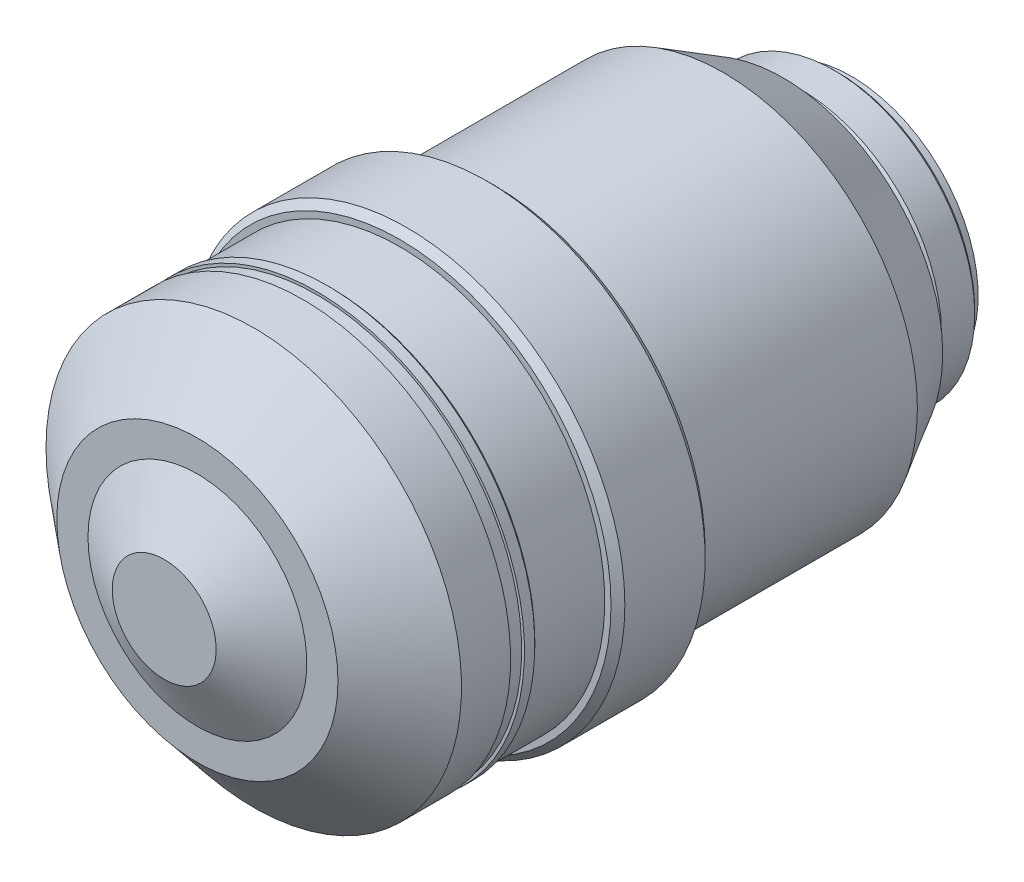
ISO-10303-21;
HEADER;
FILE_DESCRIPTION(('STEP AP214'),'2;1');
FILE_NAME('part.step','',(''),(''),'','','');
FILE_SCHEMA(('AUTOMOTIVE_DESIGN { 1 0 10303 214 1 1 1 1 }'));
ENDSEC;
DATA;
#1=APPLICATION_CONTEXT('core data for automotive mechanical design processes');
#2=APPLICATION_PROTOCOL_DEFINITION('international standard','automotive_design',2000,#1);
#3=PRODUCT_CONTEXT('',#1,'mechanical');
#4=PRODUCT('Part','Part','',(#3));
#5=PRODUCT_RELATED_PRODUCT_CATEGORY('part','',(#4));
#6=PRODUCT_DEFINITION_FORMATION('','',#4);
#7=PRODUCT_DEFINITION_CONTEXT('part definition',#1,'design');
#8=PRODUCT_DEFINITION('design','',#6,#7);
#9=PRODUCT_DEFINITION_SHAPE('','',#8);
#10=(LENGTH_UNIT() NAMED_UNIT(*) SI_UNIT(.MILLI.,.METRE.));
#11=(NAMED_UNIT(*) PLANE_ANGLE_UNIT() SI_UNIT($,.RADIAN.));
#12=(NAMED_UNIT(*) SI_UNIT($,.STERADIAN.) SOLID_ANGLE_UNIT());
#13=UNCERTAINTY_MEASURE_WITH_UNIT(LENGTH_MEASURE(1.E-05),#10,'distance_accuracy_value','');
#14=(GEOMETRIC_REPRESENTATION_CONTEXT(3) GLOBAL_UNCERTAINTY_ASSIGNED_CONTEXT((#13)) GLOBAL_UNIT_ASSIGNED_CONTEXT((#10,
#11,#12)) REPRESENTATION_CONTEXT('',''));
#15=CARTESIAN_POINT('',(0.,0.,0.));
#16=DIRECTION('',(0.,0.,1.));
#17=DIRECTION('',(1.,0.,0.));
#18=AXIS2_PLACEMENT_3D('',#15,#16,#17);
#19=CARTESIAN_POINT('',(0.,0.,-0.35));
#20=DIRECTION('',(0.,0.,1.));
#21=DIRECTION('',(1.,0.,0.));
#22=AXIS2_PLACEMENT_3D('',#19,#20,#21);
#23=PLANE('',#22);
#24=CARTESIAN_POINT('',(0.,0.,-0.349999999999996));
#25=DIRECTION('',(0.,0.,-1.));
#26=DIRECTION('',(-1.,0.,0.));
#27=AXIS2_PLACEMENT_3D('',#24,#25,#26);
#28=CIRCLE('',#27,3.75);
#29=CARTESIAN_POINT('',(-3.75,0.,-0.349999999999996));
#30=VERTEX_POINT('',#29);
#31=EDGE_CURVE('E68',#30,#30,#28,.T.);
#32=ORIENTED_EDGE('',*,*,#31,.F.);
#33=EDGE_LOOP('',(#32));
#34=FACE_BOUND('',#33,.T.);
#35=ADVANCED_FACE('F30',(#34),#23,.T.);
#36=CARTESIAN_POINT('',(0.,0.,-2.74600361713695));
#37=DIRECTION('',(0.,0.,-1.));
#38=DIRECTION('',(-1.,0.,0.));
#39=AXIS2_PLACEMENT_3D('',#36,#37,#38);
#40=CONICAL_SURFACE('',#39,7.9,1.0471975511966);
#41=ORIENTED_EDGE('',*,*,#31,.T.);
#42=EDGE_LOOP('',(#41));
#43=FACE_BOUND('',#42,.T.);
#44=CARTESIAN_POINT('',(0.,0.,-2.74600361713695));
#45=DIRECTION('',(0.,0.,-1.));
#46=DIRECTION('',(-1.,0.,0.));
#47=AXIS2_PLACEMENT_3D('',#44,#45,#46);
#48=CIRCLE('',#47,7.9);
#49=CARTESIAN_POINT('',(-7.9,0.,-2.74600361713695));
#50=VERTEX_POINT('',#49);
#51=EDGE_CURVE('E71',#50,#50,#48,.T.);
#52=ORIENTED_EDGE('',*,*,#51,.F.);
#53=EDGE_LOOP('',(#52));
#54=FACE_BOUND('',#53,.T.);
#55=ADVANCED_FACE('F150',(#43,#54),#40,.T.);
#56=CARTESIAN_POINT('',(-7.9,0.,-2.74600361713695));
#57=DIRECTION('',(0.,0.,1.));
#58=DIRECTION('',(1.,0.,0.));
#59=AXIS2_PLACEMENT_3D('',#56,#57,#58);
#60=PLANE('',#59);
#61=ORIENTED_EDGE('',*,*,#51,.T.);
#62=EDGE_LOOP('',(#61));
#63=FACE_BOUND('',#62,.T.);
#64=CARTESIAN_POINT('',(0.,0.,-2.74600361713695));
#65=DIRECTION('',(0.,0.,-1.));
#66=DIRECTION('',(-1.,0.,0.));
#67=AXIS2_PLACEMENT_3D('',#64,#65,#66);
#68=CIRCLE('',#67,10.15);
#69=CARTESIAN_POINT('',(-10.15,0.,-2.74600361713695));
#70=VERTEX_POINT('',#69);
#71=EDGE_CURVE('E74',#70,#70,#68,.T.);
#72=ORIENTED_EDGE('',*,*,#71,.F.);
#73=EDGE_LOOP('',(#72));
#74=FACE_BOUND('',#73,.T.);
#75=ADVANCED_FACE('F156',(#63,#74),#60,.T.);
#76=CARTESIAN_POINT('',(0.,0.,-6.81563682834677));
#77=DIRECTION('',(0.,0.,-1.));
#78=DIRECTION('',(-1.,0.,0.));
#79=AXIS2_PLACEMENT_3D('',#76,#77,#78);
#80=CONICAL_SURFACE('',#79,15.,0.872664625997164);
#81=ORIENTED_EDGE('',*,*,#71,.T.);
#82=EDGE_LOOP('',(#81));
#83=FACE_BOUND('',#82,.T.);
#84=CARTESIAN_POINT('',(0.,0.,-6.81563682834677));
#85=DIRECTION('',(0.,0.,-1.));
#86=DIRECTION('',(-1.,0.,0.));
#87=AXIS2_PLACEMENT_3D('',#84,#85,#86);
#88=CIRCLE('',#87,15.);
#89=CARTESIAN_POINT('',(-15.,0.,-6.81563682834677));
#90=VERTEX_POINT('',#89);
#91=EDGE_CURVE('E77',#90,#90,#88,.T.);
#92=ORIENTED_EDGE('',*,*,#91,.F.);
#93=EDGE_LOOP('',(#92));
#94=FACE_BOUND('',#93,.T.);
#95=ADVANCED_FACE('F251',(#83,#94),#80,.T.);
#96=CARTESIAN_POINT('',(0.,0.,-49.96));
#97=DIRECTION('',(0.,0.,-1.));
#98=DIRECTION('',(-1.,0.,0.));
#99=AXIS2_PLACEMENT_3D('',#96,#97,#98);
#100=CYLINDRICAL_SURFACE('',#99,15.);
#101=ORIENTED_EDGE('',*,*,#91,.T.);
#102=EDGE_LOOP('',(#101));
#103=FACE_BOUND('',#102,.T.);
#104=CARTESIAN_POINT('',(0.,0.,-10.36));
#105=DIRECTION('',(0.,0.,-1.));
#106=DIRECTION('',(-1.,0.,0.));
#107=AXIS2_PLACEMENT_3D('',#104,#105,#106);
#108=CIRCLE('',#107,15.);
#109=CARTESIAN_POINT('',(-15.,0.,-10.36));
#110=VERTEX_POINT('',#109);
#111=EDGE_CURVE('E80',#110,#110,#108,.T.);
#112=ORIENTED_EDGE('',*,*,#111,.F.);
#113=EDGE_LOOP('',(#112));
#114=FACE_BOUND('',#113,.T.);
#115=ADVANCED_FACE('F247',(#103,#114),#100,.T.);
#116=CARTESIAN_POINT('',(-14.8,0.,-10.36));
#117=DIRECTION('',(0.,0.,-1.));
#118=DIRECTION('',(-1.,0.,0.));
#119=AXIS2_PLACEMENT_3D('',#116,#117,#118);
#120=PLANE('',#119);
#121=ORIENTED_EDGE('',*,*,#111,.T.);
#122=EDGE_LOOP('',(#121));
#123=FACE_BOUND('',#122,.T.);
#124=CARTESIAN_POINT('',(0.,0.,-10.36));
#125=DIRECTION('',(0.,0.,-1.));
#126=DIRECTION('',(-1.,0.,0.));
#127=AXIS2_PLACEMENT_3D('',#124,#125,#126);
#128=CIRCLE('',#127,14.8);
#129=CARTESIAN_POINT('',(-14.8,0.,-10.36));
#130=VERTEX_POINT('',#129);
#131=EDGE_CURVE('E83',#130,#130,#128,.T.);
#132=ORIENTED_EDGE('',*,*,#131,.F.);
#133=EDGE_LOOP('',(#132));
#134=FACE_BOUND('',#133,.T.);
#135=ADVANCED_FACE('F243',(#123,#134),#120,.T.);
#136=CARTESIAN_POINT('',(0.,0.,-49.96));
#137=DIRECTION('',(0.,0.,-1.));
#138=DIRECTION('',(-1.,0.,0.));
#139=AXIS2_PLACEMENT_3D('',#136,#137,#138);
#140=CYLINDRICAL_SURFACE('',#139,14.8);
#141=ORIENTED_EDGE('',*,*,#131,.T.);
#142=EDGE_LOOP('',(#141));
#143=FACE_BOUND('',#142,.T.);
#144=CARTESIAN_POINT('',(0.,0.,-11.36));
#145=DIRECTION('',(0.,0.,-1.));
#146=DIRECTION('',(-1.,0.,0.));
#147=AXIS2_PLACEMENT_3D('',#144,#145,#146);
#148=CIRCLE('',#147,14.8);
#149=CARTESIAN_POINT('',(-14.8,0.,-11.36));
#150=VERTEX_POINT('',#149);
#151=EDGE_CURVE('E86',#150,#150,#148,.T.);
#152=ORIENTED_EDGE('',*,*,#151,.F.);
#153=EDGE_LOOP('',(#152));
#154=FACE_BOUND('',#153,.T.);
#155=ADVANCED_FACE('F239',(#143,#154),#140,.T.);
#156=CARTESIAN_POINT('',(-15.,0.,-11.36));
#157=DIRECTION('',(0.,0.,1.));
#158=DIRECTION('',(1.,0.,0.));
#159=AXIS2_PLACEMENT_3D('',#156,#157,#158);
#160=PLANE('',#159);
#161=ORIENTED_EDGE('',*,*,#151,.T.);
#162=EDGE_LOOP('',(#161));
#163=FACE_BOUND('',#162,.T.);
#164=CARTESIAN_POINT('',(0.,0.,-11.36));
#165=DIRECTION('',(0.,0.,-1.));
#166=DIRECTION('',(-1.,0.,0.));
#167=AXIS2_PLACEMENT_3D('',#164,#165,#166);
#168=CIRCLE('',#167,15.);
#169=CARTESIAN_POINT('',(-15.,0.,-11.36));
#170=VERTEX_POINT('',#169);
#171=EDGE_CURVE('E89',#170,#170,#168,.T.);
#172=ORIENTED_EDGE('',*,*,#171,.F.);
#173=EDGE_LOOP('',(#172));
#174=FACE_BOUND('',#173,.T.);
#175=ADVANCED_FACE('F235',(#163,#174),#160,.T.);
#176=CARTESIAN_POINT('',(0.,0.,-49.96));
#177=DIRECTION('',(0.,0.,-1.));
#178=DIRECTION('',(-1.,0.,0.));
#179=AXIS2_PLACEMENT_3D('',#176,#177,#178);
#180=CYLINDRICAL_SURFACE('',#179,15.);
#181=CARTESIAN_POINT('',(0.,0.,-12.11));
#182=DIRECTION('',(0.,0.,-1.));
#183=DIRECTION('',(-1.,0.,0.));
#184=AXIS2_PLACEMENT_3D('',#181,#182,#183);
#185=CIRCLE('',#184,15.);
#186=CARTESIAN_POINT('',(-15.,0.,-12.11));
#187=VERTEX_POINT('',#186);
#188=EDGE_CURVE('E53',#187,#187,#185,.F.);
#189=ORIENTED_EDGE('',*,*,#188,.T.);
#190=EDGE_LOOP('',(#189));
#191=FACE_BOUND('',#190,.T.);
#192=ORIENTED_EDGE('',*,*,#171,.T.);
#193=EDGE_LOOP('',(#192));
#194=FACE_BOUND('',#193,.T.);
#195=ADVANCED_FACE('F231',(#191,#194),#180,.T.);
#196=CARTESIAN_POINT('',(0.,0.,-49.96));
#197=DIRECTION('',(0.,0.,-1.));
#198=DIRECTION('',(-1.,0.,0.));
#199=AXIS2_PLACEMENT_3D('',#196,#197,#198);
#200=CYLINDRICAL_SURFACE('',#199,14.8);
#201=CARTESIAN_POINT('',(0.,0.,-12.31));
#202=DIRECTION('',(0.,0.,1.));
#203=DIRECTION('',(1.,0.,0.));
#204=AXIS2_PLACEMENT_3D('',#201,#202,#203);
#205=CIRCLE('',#204,14.8);
#206=CARTESIAN_POINT('',(14.8,0.,-12.31));
#207=VERTEX_POINT('',#206);
#208=EDGE_CURVE('E50',#207,#207,#205,.F.);
#209=ORIENTED_EDGE('',*,*,#208,.T.);
#210=EDGE_LOOP('',(#209));
#211=FACE_BOUND('',#210,.T.);
#212=CARTESIAN_POINT('',(0.,0.,-17.36));
#213=DIRECTION('',(0.,0.,-1.));
#214=DIRECTION('',(-1.,0.,0.));
#215=AXIS2_PLACEMENT_3D('',#212,#213,#214);
#216=CIRCLE('',#215,14.8);
#217=CARTESIAN_POINT('',(-14.8,0.,-17.36));
#218=VERTEX_POINT('',#217);
#219=EDGE_CURVE('E92',#218,#218,#216,.T.);
#220=ORIENTED_EDGE('',*,*,#219,.F.);
#221=EDGE_LOOP('',(#220));
#222=FACE_BOUND('',#221,.T.);
#223=ADVANCED_FACE('F228',(#211,#222),#200,.T.);
#224=CARTESIAN_POINT('',(-15.75,0.,-17.36));
#225=DIRECTION('',(0.,0.,1.));
#226=DIRECTION('',(1.,0.,0.));
#227=AXIS2_PLACEMENT_3D('',#224,#225,#226);
#228=PLANE('',#227);
#229=CARTESIAN_POINT('',(0.,0.,-17.36));
#230=DIRECTION('',(0.,0.,1.));
#231=DIRECTION('',(1.,0.,0.));
#232=AXIS2_PLACEMENT_3D('',#229,#230,#231);
#233=CIRCLE('',#232,15.25);
#234=CARTESIAN_POINT('',(15.25,0.,-17.36));
#235=VERTEX_POINT('',#234);
#236=EDGE_CURVE('E10',#235,#235,#233,.T.);
#237=ORIENTED_EDGE('',*,*,#236,.T.);
#238=EDGE_LOOP('',(#237));
#239=FACE_BOUND('',#238,.T.);
#240=ORIENTED_EDGE('',*,*,#219,.T.);
#241=EDGE_LOOP('',(#240));
#242=FACE_BOUND('',#241,.T.);
#243=ADVANCED_FACE('F225',(#239,#242),#228,.T.);
#244=CARTESIAN_POINT('',(0.,0.,-49.96));
#245=DIRECTION('',(0.,0.,-1.));
#246=DIRECTION('',(-1.,0.,0.));
#247=AXIS2_PLACEMENT_3D('',#244,#245,#246);
#248=CYLINDRICAL_SURFACE('',#247,15.75);
#249=CARTESIAN_POINT('',(0.,0.,-23.66));
#250=DIRECTION('',(0.,0.,-1.));
#251=DIRECTION('',(-1.,0.,0.));
#252=AXIS2_PLACEMENT_3D('',#249,#250,#251);
#253=CIRCLE('',#252,15.75);
#254=CARTESIAN_POINT('',(-15.75,0.,-23.66));
#255=VERTEX_POINT('',#254);
#256=EDGE_CURVE('E37',#255,#255,#253,.F.);
#257=ORIENTED_EDGE('',*,*,#256,.T.);
#258=EDGE_LOOP('',(#257));
#259=FACE_BOUND('',#258,.T.);
#260=CARTESIAN_POINT('',(0.,0.,-17.86));
#261=DIRECTION('',(0.,0.,1.));
#262=DIRECTION('',(1.,0.,0.));
#263=AXIS2_PLACEMENT_3D('',#260,#261,#262);
#264=CIRCLE('',#263,15.75);
#265=CARTESIAN_POINT('',(15.75,0.,-17.86));
#266=VERTEX_POINT('',#265);
#267=EDGE_CURVE('E41',#266,#266,#264,.F.);
#268=ORIENTED_EDGE('',*,*,#267,.T.);
#269=EDGE_LOOP('',(#268));
#270=FACE_BOUND('',#269,.T.);
#271=ADVANCED_FACE('F186',(#259,#270),#248,.T.);
#272=CARTESIAN_POINT('',(-14.,0.,-24.16));
#273=DIRECTION('',(0.,0.,-1.));
#274=DIRECTION('',(-1.,0.,0.));
#275=AXIS2_PLACEMENT_3D('',#272,#273,#274);
#276=PLANE('',#275);
#277=CARTESIAN_POINT('',(0.,0.,-24.16));
#278=DIRECTION('',(0.,0.,-1.));
#279=DIRECTION('',(-1.,0.,0.));
#280=AXIS2_PLACEMENT_3D('',#277,#278,#279);
#281=CIRCLE('',#280,15.25);
#282=CARTESIAN_POINT('',(-15.25,0.,-24.16));
#283=VERTEX_POINT('',#282);
#284=EDGE_CURVE('E45',#283,#283,#281,.T.);
#285=ORIENTED_EDGE('',*,*,#284,.T.);
#286=EDGE_LOOP('',(#285));
#287=FACE_BOUND('',#286,.T.);
#288=CARTESIAN_POINT('',(0.,0.,-24.16));
#289=DIRECTION('',(0.,0.,-1.));
#290=DIRECTION('',(-1.,0.,0.));
#291=AXIS2_PLACEMENT_3D('',#288,#289,#290);
#292=CIRCLE('',#291,14.);
#293=CARTESIAN_POINT('',(-14.,0.,-24.16));
#294=VERTEX_POINT('',#293);
#295=EDGE_CURVE('E95',#294,#294,#292,.T.);
#296=ORIENTED_EDGE('',*,*,#295,.F.);
#297=EDGE_LOOP('',(#296));
#298=FACE_BOUND('',#297,.T.);
#299=ADVANCED_FACE('F182',(#287,#298),#276,.T.);
#300=CARTESIAN_POINT('',(0.,0.,-49.96));
#301=DIRECTION('',(0.,0.,-1.));
#302=DIRECTION('',(-1.,0.,0.));
#303=AXIS2_PLACEMENT_3D('',#300,#301,#302);
#304=CYLINDRICAL_SURFACE('',#303,14.);
#305=ORIENTED_EDGE('',*,*,#295,.T.);
#306=EDGE_LOOP('',(#305));
#307=FACE_BOUND('',#306,.T.);
#308=CARTESIAN_POINT('',(0.,0.,-40.7298729810778));
#309=DIRECTION('',(0.,0.,-1.));
#310=DIRECTION('',(-1.,0.,0.));
#311=AXIS2_PLACEMENT_3D('',#308,#309,#310);
#312=CIRCLE('',#311,14.);
#313=CARTESIAN_POINT('',(-14.,0.,-40.7298729810778));
#314=VERTEX_POINT('',#313);
#315=EDGE_CURVE('E98',#314,#314,#312,.T.);
#316=ORIENTED_EDGE('',*,*,#315,.F.);
#317=EDGE_LOOP('',(#316));
#318=FACE_BOUND('',#317,.T.);
#319=ADVANCED_FACE('F185',(#307,#318),#304,.T.);
#320=CARTESIAN_POINT('',(0.,0.,-45.06));
#321=DIRECTION('',(0.,0.,1.));
#322=DIRECTION('',(1.,0.,0.));
#323=AXIS2_PLACEMENT_3D('',#320,#321,#322);
#324=CONICAL_SURFACE('',#323,11.5,0.5235987755983);
#325=ORIENTED_EDGE('',*,*,#315,.T.);
#326=EDGE_LOOP('',(#325));
#327=FACE_BOUND('',#326,.T.);
#328=CARTESIAN_POINT('',(0.,0.,-45.06));
#329=DIRECTION('',(0.,0.,-1.));
#330=DIRECTION('',(-1.,0.,0.));
#331=AXIS2_PLACEMENT_3D('',#328,#329,#330);
#332=CIRCLE('',#331,11.5);
#333=CARTESIAN_POINT('',(-11.5,0.,-45.06));
#334=VERTEX_POINT('',#333);
#335=EDGE_CURVE('E101',#334,#334,#332,.T.);
#336=ORIENTED_EDGE('',*,*,#335,.F.);
#337=EDGE_LOOP('',(#336));
#338=FACE_BOUND('',#337,.T.);
#339=ADVANCED_FACE('F192',(#327,#338),#324,.T.);
#340=CARTESIAN_POINT('',(-9.15999999999999,0.,-45.06));
#341=DIRECTION('',(0.,0.,-1.));
#342=DIRECTION('',(-1.,0.,0.));
#343=AXIS2_PLACEMENT_3D('',#340,#341,#342);
#344=PLANE('',#343);
#345=ORIENTED_EDGE('',*,*,#335,.T.);
#346=EDGE_LOOP('',(#345));
#347=FACE_BOUND('',#346,.T.);
#348=CARTESIAN_POINT('',(0.,0.,-45.06));
#349=DIRECTION('',(0.,0.,-1.));
#350=DIRECTION('',(-1.,0.,0.));
#351=AXIS2_PLACEMENT_3D('',#348,#349,#350);
#352=CIRCLE('',#351,9.15999999999999);
#353=CARTESIAN_POINT('',(-9.15999999999999,0.,-45.06));
#354=VERTEX_POINT('',#353);
#355=EDGE_CURVE('E104',#354,#354,#352,.T.);
#356=ORIENTED_EDGE('',*,*,#355,.F.);
#357=EDGE_LOOP('',(#356));
#358=FACE_BOUND('',#357,.T.);
#359=ADVANCED_FACE('F198',(#347,#358),#344,.T.);
#360=CARTESIAN_POINT('',(0.,0.,-49.96));
#361=DIRECTION('',(0.,0.,-1.));
#362=DIRECTION('',(-1.,0.,0.));
#363=AXIS2_PLACEMENT_3D('',#360,#361,#362);
#364=CYLINDRICAL_SURFACE('',#363,9.15999999999999);
#365=ORIENTED_EDGE('',*,*,#355,.T.);
#366=EDGE_LOOP('',(#365));
#367=FACE_BOUND('',#366,.T.);
#368=CARTESIAN_POINT('',(0.,0.,-46.06));
#369=DIRECTION('',(0.,0.,-1.));
#370=DIRECTION('',(-1.,0.,0.));
#371=AXIS2_PLACEMENT_3D('',#368,#369,#370);
#372=CIRCLE('',#371,9.15999999999999);
#373=CARTESIAN_POINT('',(-9.15999999999999,0.,-46.06));
#374=VERTEX_POINT('',#373);
#375=EDGE_CURVE('E107',#374,#374,#372,.T.);
#376=ORIENTED_EDGE('',*,*,#375,.F.);
#377=EDGE_LOOP('',(#376));
#378=FACE_BOUND('',#377,.T.);
#379=ADVANCED_FACE('F204',(#367,#378),#364,.T.);
#380=CARTESIAN_POINT('',(-10.16,0.,-46.06));
#381=DIRECTION('',(0.,0.,1.));
#382=DIRECTION('',(1.,0.,0.));
#383=AXIS2_PLACEMENT_3D('',#380,#381,#382);
#384=PLANE('',#383);
#385=CARTESIAN_POINT('',(0.,0.,-46.06));
#386=DIRECTION('',(0.,0.,1.));
#387=DIRECTION('',(1.,0.,0.));
#388=AXIS2_PLACEMENT_3D('',#385,#386,#387);
#389=CIRCLE('',#388,9.90999999999999);
#390=CARTESIAN_POINT('',(9.90999999999999,0.,-46.06));
#391=VERTEX_POINT('',#390);
#392=EDGE_CURVE('E56',#391,#391,#389,.T.);
#393=ORIENTED_EDGE('',*,*,#392,.T.);
#394=EDGE_LOOP('',(#393));
#395=FACE_BOUND('',#394,.T.);
#396=ORIENTED_EDGE('',*,*,#375,.T.);
#397=EDGE_LOOP('',(#396));
#398=FACE_BOUND('',#397,.T.);
#399=ADVANCED_FACE('F210',(#395,#398),#384,.T.);
#400=CARTESIAN_POINT('',(0.,0.,-49.96));
#401=DIRECTION('',(0.,0.,-1.));
#402=DIRECTION('',(-1.,0.,0.));
#403=AXIS2_PLACEMENT_3D('',#400,#401,#402);
#404=CYLINDRICAL_SURFACE('',#403,10.16);
#405=CARTESIAN_POINT('',(0.,0.,-48.71));
#406=DIRECTION('',(0.,0.,-1.));
#407=DIRECTION('',(-1.,0.,0.));
#408=AXIS2_PLACEMENT_3D('',#405,#406,#407);
#409=CIRCLE('',#408,10.16);
#410=CARTESIAN_POINT('',(-10.16,0.,-48.71));
#411=VERTEX_POINT('',#410);
#412=EDGE_CURVE('E59',#411,#411,#409,.F.);
#413=ORIENTED_EDGE('',*,*,#412,.T.);
#414=EDGE_LOOP('',(#413));
#415=FACE_BOUND('',#414,.T.);
#416=CARTESIAN_POINT('',(0.,0.,-46.31));
#417=DIRECTION('',(0.,0.,1.));
#418=DIRECTION('',(1.,0.,0.));
#419=AXIS2_PLACEMENT_3D('',#416,#417,#418);
#420=CIRCLE('',#419,10.16);
#421=CARTESIAN_POINT('',(10.16,0.,-46.31));
#422=VERTEX_POINT('',#421);
#423=EDGE_CURVE('E62',#422,#422,#420,.F.);
#424=ORIENTED_EDGE('',*,*,#423,.T.);
#425=EDGE_LOOP('',(#424));
#426=FACE_BOUND('',#425,.T.);
#427=ADVANCED_FACE('F146',(#415,#426),#404,.T.);
#428=CARTESIAN_POINT('',(-9.15999999999999,0.,-48.96));
#429=DIRECTION('',(0.,0.,-1.));
#430=DIRECTION('',(-1.,0.,0.));
#431=AXIS2_PLACEMENT_3D('',#428,#429,#430);
#432=PLANE('',#431);
#433=CARTESIAN_POINT('',(0.,0.,-48.96));
#434=DIRECTION('',(0.,0.,-1.));
#435=DIRECTION('',(-1.,0.,0.));
#436=AXIS2_PLACEMENT_3D('',#433,#434,#435);
#437=CIRCLE('',#436,9.91);
#438=CARTESIAN_POINT('',(-9.91,0.,-48.96));
#439=VERTEX_POINT('',#438);
#440=EDGE_CURVE('E65',#439,#439,#437,.T.);
#441=ORIENTED_EDGE('',*,*,#440,.T.);
#442=EDGE_LOOP('',(#441));
#443=FACE_BOUND('',#442,.T.);
#444=CARTESIAN_POINT('',(0.,0.,-48.96));
#445=DIRECTION('',(0.,0.,-1.));
#446=DIRECTION('',(-1.,0.,0.));
#447=AXIS2_PLACEMENT_3D('',#444,#445,#446);
#448=CIRCLE('',#447,9.15999999999999);
#449=CARTESIAN_POINT('',(-9.15999999999999,0.,-48.96));
#450=VERTEX_POINT('',#449);
#451=EDGE_CURVE('E110',#450,#450,#448,.T.);
#452=ORIENTED_EDGE('',*,*,#451,.F.);
#453=EDGE_LOOP('',(#452));
#454=FACE_BOUND('',#453,.T.);
#455=ADVANCED_FACE('F140',(#443,#454),#432,.T.);
#456=CARTESIAN_POINT('',(0.,0.,-49.96));
#457=DIRECTION('',(0.,0.,-1.));
#458=DIRECTION('',(-1.,0.,0.));
#459=AXIS2_PLACEMENT_3D('',#456,#457,#458);
#460=CYLINDRICAL_SURFACE('',#459,9.15999999999999);
#461=ORIENTED_EDGE('',*,*,#451,.T.);
#462=EDGE_LOOP('',(#461));
#463=FACE_BOUND('',#462,.T.);
#464=CARTESIAN_POINT('',(0.,0.,-49.96));
#465=DIRECTION('',(0.,0.,-1.));
#466=DIRECTION('',(-1.,0.,0.));
#467=AXIS2_PLACEMENT_3D('',#464,#465,#466);
#468=CIRCLE('',#467,9.15999999999999);
#469=CARTESIAN_POINT('',(-9.15999999999999,0.,-49.96));
#470=VERTEX_POINT('',#469);
#471=EDGE_CURVE('E113',#470,#470,#468,.T.);
#472=ORIENTED_EDGE('',*,*,#471,.F.);
#473=EDGE_LOOP('',(#472));
#474=FACE_BOUND('',#473,.T.);
#475=ADVANCED_FACE('F135',(#463,#474),#460,.T.);
#476=CARTESIAN_POINT('',(0.,0.,-49.96));
#477=DIRECTION('',(0.,0.,-1.));
#478=DIRECTION('',(-1.,0.,0.));
#479=AXIS2_PLACEMENT_3D('',#476,#477,#478);
#480=PLANE('',#479);
#481=CARTESIAN_POINT('',(0.,0.,-49.96));
#482=DIRECTION('',(0.,0.,-1.));
#483=DIRECTION('',(-1.,0.,0.));
#484=AXIS2_PLACEMENT_3D('',#481,#482,#483);
#485=CIRCLE('',#484,4.275);
#486=CARTESIAN_POINT('',(-4.275,0.,-49.96));
#487=VERTEX_POINT('',#486);
#488=EDGE_CURVE('E117',#487,#487,#485,.T.);
#489=ORIENTED_EDGE('',*,*,#488,.F.);
#490=EDGE_LOOP('',(#489));
#491=FACE_BOUND('',#490,.T.);
#492=ORIENTED_EDGE('',*,*,#471,.T.);
#493=EDGE_LOOP('',(#492));
#494=FACE_BOUND('',#493,.T.);
#495=ADVANCED_FACE('F131',(#491,#494),#480,.T.);
#496=CARTESIAN_POINT('',(0.,0.,-48.96));
#497=DIRECTION('',(0.,0.,1.));
#498=DIRECTION('',(1.,0.,0.));
#499=AXIS2_PLACEMENT_3D('',#496,#497,#498);
#500=CONICAL_SURFACE('',#499,9.91,0.785398163397448);
#501=ORIENTED_EDGE('',*,*,#412,.F.);
#502=EDGE_LOOP('',(#501));
#503=FACE_BOUND('',#502,.T.);
#504=ORIENTED_EDGE('',*,*,#440,.F.);
#505=EDGE_LOOP('',(#504));
#506=FACE_BOUND('',#505,.T.);
#507=ADVANCED_FACE('F134',(#503,#506),#500,.T.);
#508=CARTESIAN_POINT('',(0.,0.,-46.31));
#509=DIRECTION('',(0.,0.,-1.));
#510=DIRECTION('',(-1.,0.,0.));
#511=AXIS2_PLACEMENT_3D('',#508,#509,#510);
#512=CONICAL_SURFACE('',#511,10.16,0.785398163397435);
#513=ORIENTED_EDGE('',*,*,#392,.F.);
#514=EDGE_LOOP('',(#513));
#515=FACE_BOUND('',#514,.T.);
#516=ORIENTED_EDGE('',*,*,#423,.F.);
#517=EDGE_LOOP('',(#516));
#518=FACE_BOUND('',#517,.T.);
#519=ADVANCED_FACE('F164',(#515,#518),#512,.T.);
#520=CARTESIAN_POINT('',(0.,0.,-12.36));
#521=DIRECTION('',(0.,0.,1.));
#522=DIRECTION('',(1.,0.,0.));
#523=AXIS2_PLACEMENT_3D('',#520,#521,#522);
#524=CONICAL_SURFACE('',#523,14.75,0.785398163397455);
#525=ORIENTED_EDGE('',*,*,#188,.F.);
#526=EDGE_LOOP('',(#525));
#527=FACE_BOUND('',#526,.T.);
#528=ORIENTED_EDGE('',*,*,#208,.F.);
#529=EDGE_LOOP('',(#528));
#530=FACE_BOUND('',#529,.T.);
#531=ADVANCED_FACE('F168',(#527,#530),#524,.T.);
#532=CARTESIAN_POINT('',(0.,0.,-24.16));
#533=DIRECTION('',(0.,0.,1.));
#534=DIRECTION('',(1.,0.,0.));
#535=AXIS2_PLACEMENT_3D('',#532,#533,#534);
#536=CONICAL_SURFACE('',#535,15.25,0.785398163397445);
#537=ORIENTED_EDGE('',*,*,#256,.F.);
#538=EDGE_LOOP('',(#537));
#539=FACE_BOUND('',#538,.T.);
#540=ORIENTED_EDGE('',*,*,#284,.F.);
#541=EDGE_LOOP('',(#540));
#542=FACE_BOUND('',#541,.T.);
#543=ADVANCED_FACE('F171',(#539,#542),#536,.T.);
#544=CARTESIAN_POINT('',(0.,0.,-17.86));
#545=DIRECTION('',(0.,0.,-1.));
#546=DIRECTION('',(-1.,0.,0.));
#547=AXIS2_PLACEMENT_3D('',#544,#545,#546);
#548=CONICAL_SURFACE('',#547,15.75,0.785398163397448);
#549=ORIENTED_EDGE('',*,*,#236,.F.);
#550=EDGE_LOOP('',(#549));
#551=FACE_BOUND('',#550,.T.);
#552=ORIENTED_EDGE('',*,*,#267,.F.);
#553=EDGE_LOOP('',(#552));
#554=FACE_BOUND('',#553,.T.);
#555=ADVANCED_FACE('F32',(#551,#554),#548,.T.);
#556=CARTESIAN_POINT('',(0.,0.,-48.96));
#557=DIRECTION('',(0.,0.,-1.));
#558=DIRECTION('',(-1.,0.,0.));
#559=AXIS2_PLACEMENT_3D('',#556,#557,#558);
#560=CYLINDRICAL_SURFACE('',#559,4.275);
#561=CARTESIAN_POINT('',(0.,0.,-48.96));
#562=DIRECTION('',(0.,0.,-1.));
#563=DIRECTION('',(-1.,0.,0.));
#564=AXIS2_PLACEMENT_3D('',#561,#562,#563);
#565=CIRCLE('',#564,4.275);
#566=CARTESIAN_POINT('',(-4.275,0.,-48.96));
#567=VERTEX_POINT('',#566);
#568=EDGE_CURVE('E116',#567,#567,#565,.T.);
#569=ORIENTED_EDGE('',*,*,#568,.F.);
#570=EDGE_LOOP('',(#569));
#571=FACE_BOUND('',#570,.T.);
#572=ORIENTED_EDGE('',*,*,#488,.T.);
#573=EDGE_LOOP('',(#572));
#574=FACE_BOUND('',#573,.T.);
#575=ADVANCED_FACE('F125',(#571,#574),#560,.F.);
#576=CARTESIAN_POINT('',(0.,0.,-48.96));
#577=DIRECTION('',(0.,0.,-1.));
#578=DIRECTION('',(-1.,0.,0.));
#579=AXIS2_PLACEMENT_3D('',#576,#577,#578);
#580=PLANE('',#579);
#581=ORIENTED_EDGE('',*,*,#568,.T.);
#582=EDGE_LOOP('',(#581));
#583=FACE_BOUND('',#582,.T.);
#584=ADVANCED_FACE('F123',(#583),#580,.T.);
#585=CLOSED_SHELL('',(#35,#55,#75,#95,#115,#135,#155,#175,#195,#223,#243,#271,#299,#319,#339,
#359,#379,#399,#427,#455,#475,#495,#507,#519,#531,#543,#555,#575,#584));
#586=MANIFOLD_SOLID_BREP('B2',#585);
#587=ADVANCED_BREP_SHAPE_REPRESENTATION('',(#18,#586),#14);
#588=SHAPE_DEFINITION_REPRESENTATION(#9,#587);
ENDSEC;
END-ISO-10303-21;
